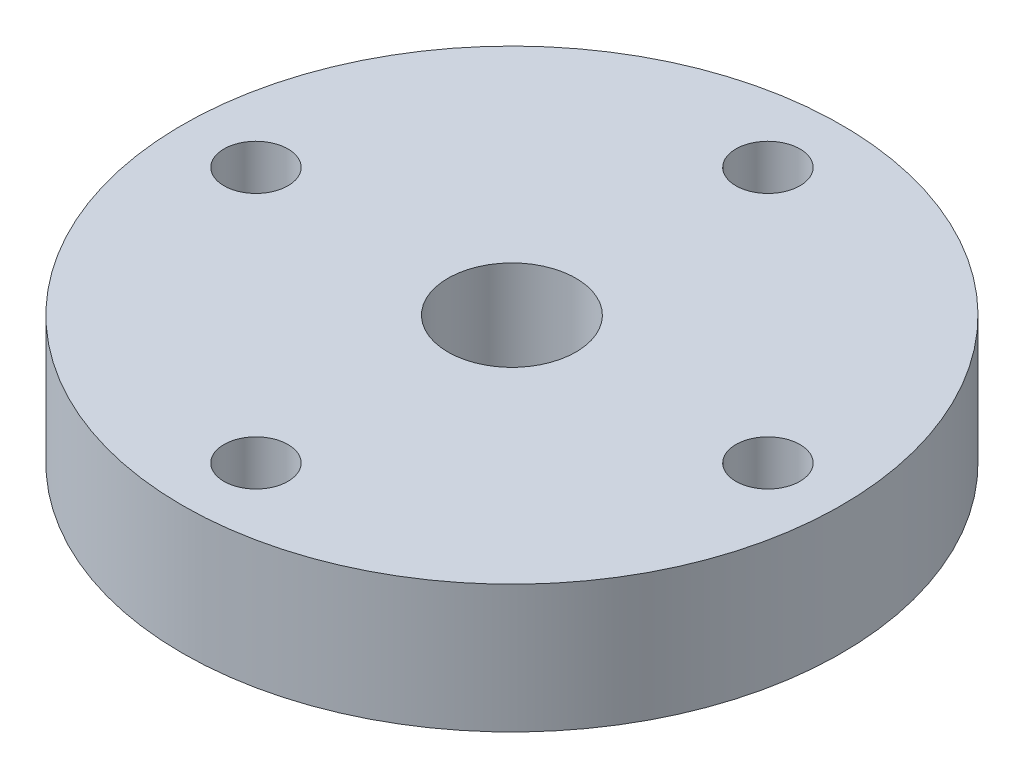
ISO-10303-21;
HEADER;
FILE_DESCRIPTION(('STEP AP214'),'2;1');
FILE_NAME('part.step','',(''),(''),'','','');
FILE_SCHEMA(('AUTOMOTIVE_DESIGN { 1 0 10303 214 1 1 1 1 }'));
ENDSEC;
DATA;
#1=APPLICATION_CONTEXT('core data for automotive mechanical design processes');
#2=APPLICATION_PROTOCOL_DEFINITION('international standard','automotive_design',2000,#1);
#3=PRODUCT_CONTEXT('',#1,'mechanical');
#4=PRODUCT('Part','Part','',(#3));
#5=PRODUCT_RELATED_PRODUCT_CATEGORY('part','',(#4));
#6=PRODUCT_DEFINITION_FORMATION('','',#4);
#7=PRODUCT_DEFINITION_CONTEXT('part definition',#1,'design');
#8=PRODUCT_DEFINITION('design','',#6,#7);
#9=PRODUCT_DEFINITION_SHAPE('','',#8);
#10=(LENGTH_UNIT() NAMED_UNIT(*) SI_UNIT(.MILLI.,.METRE.));
#11=(NAMED_UNIT(*) PLANE_ANGLE_UNIT() SI_UNIT($,.RADIAN.));
#12=(NAMED_UNIT(*) SI_UNIT($,.STERADIAN.) SOLID_ANGLE_UNIT());
#13=UNCERTAINTY_MEASURE_WITH_UNIT(LENGTH_MEASURE(1.E-05),#10,'distance_accuracy_value','');
#14=(GEOMETRIC_REPRESENTATION_CONTEXT(3) GLOBAL_UNCERTAINTY_ASSIGNED_CONTEXT((#13)) GLOBAL_UNIT_ASSIGNED_CONTEXT((#10,
#11,#12)) REPRESENTATION_CONTEXT('',''));
#15=CARTESIAN_POINT('',(0.,0.,0.));
#16=DIRECTION('',(0.,0.,1.));
#17=DIRECTION('',(1.,0.,0.));
#18=AXIS2_PLACEMENT_3D('',#15,#16,#17);
#19=CARTESIAN_POINT('',(0.,0.,0.));
#20=DIRECTION('',(0.,1.,0.));
#21=DIRECTION('',(0.,0.,1.));
#22=AXIS2_PLACEMENT_3D('',#19,#20,#21);
#23=PLANE('',#22);
#24=CARTESIAN_POINT('',(0.,0.,0.));
#25=DIRECTION('',(0.,1.,0.));
#26=DIRECTION('',(0.,0.,1.));
#27=AXIS2_PLACEMENT_3D('',#24,#25,#26);
#28=CIRCLE('',#27,2.);
#29=CARTESIAN_POINT('',(0.,0.,2.));
#30=VERTEX_POINT('',#29);
#31=EDGE_CURVE('E43',#30,#30,#28,.T.);
#32=ORIENTED_EDGE('',*,*,#31,.T.);
#33=EDGE_LOOP('',(#32));
#34=FACE_BOUND('',#33,.T.);
#35=CARTESIAN_POINT('',(0.,0.,0.));
#36=DIRECTION('',(0.,-1.,0.));
#37=DIRECTION('',(0.,0.,-1.));
#38=AXIS2_PLACEMENT_3D('',#35,#36,#37);
#39=CIRCLE('',#38,4.25);
#40=CARTESIAN_POINT('',(0.,0.,-4.25));
#41=VERTEX_POINT('',#40);
#42=EDGE_CURVE('E79',#41,#41,#39,.T.);
#43=ORIENTED_EDGE('',*,*,#42,.T.);
#44=EDGE_LOOP('',(#43));
#45=FACE_BOUND('',#44,.T.);
#46=ADVANCED_FACE('F30',(#34,#45),#23,.F.);
#47=CARTESIAN_POINT('',(0.,4.,0.));
#48=DIRECTION('',(0.,1.,0.));
#49=DIRECTION('',(0.,0.,1.));
#50=AXIS2_PLACEMENT_3D('',#47,#48,#49);
#51=PLANE('',#50);
#52=CARTESIAN_POINT('',(0.,4.,8.));
#53=DIRECTION('',(0.,1.,0.));
#54=DIRECTION('',(0.,0.,1.));
#55=AXIS2_PLACEMENT_3D('',#52,#53,#54);
#56=CIRCLE('',#55,1.);
#57=CARTESIAN_POINT('',(0.,4.,9.));
#58=VERTEX_POINT('',#57);
#59=EDGE_CURVE('E67',#58,#58,#56,.T.);
#60=ORIENTED_EDGE('',*,*,#59,.F.);
#61=EDGE_LOOP('',(#60));
#62=FACE_BOUND('',#61,.T.);
#63=CARTESIAN_POINT('',(8.,4.,0.));
#64=DIRECTION('',(0.,1.,0.));
#65=DIRECTION('',(0.,0.,1.));
#66=AXIS2_PLACEMENT_3D('',#63,#64,#65);
#67=CIRCLE('',#66,1.);
#68=CARTESIAN_POINT('',(8.,4.,1.));
#69=VERTEX_POINT('',#68);
#70=EDGE_CURVE('E61',#69,#69,#67,.T.);
#71=ORIENTED_EDGE('',*,*,#70,.F.);
#72=EDGE_LOOP('',(#71));
#73=FACE_BOUND('',#72,.T.);
#74=CARTESIAN_POINT('',(-8.,4.,0.));
#75=DIRECTION('',(0.,1.,0.));
#76=DIRECTION('',(0.,0.,1.));
#77=AXIS2_PLACEMENT_3D('',#74,#75,#76);
#78=CIRCLE('',#77,1.);
#79=CARTESIAN_POINT('',(-8.,4.,1.));
#80=VERTEX_POINT('',#79);
#81=EDGE_CURVE('E55',#80,#80,#78,.T.);
#82=ORIENTED_EDGE('',*,*,#81,.F.);
#83=EDGE_LOOP('',(#82));
#84=FACE_BOUND('',#83,.T.);
#85=CARTESIAN_POINT('',(0.,4.,-8.));
#86=DIRECTION('',(0.,1.,0.));
#87=DIRECTION('',(0.,0.,1.));
#88=AXIS2_PLACEMENT_3D('',#85,#86,#87);
#89=CIRCLE('',#88,1.);
#90=CARTESIAN_POINT('',(0.,4.,-7.));
#91=VERTEX_POINT('',#90);
#92=EDGE_CURVE('E49',#91,#91,#89,.T.);
#93=ORIENTED_EDGE('',*,*,#92,.F.);
#94=EDGE_LOOP('',(#93));
#95=FACE_BOUND('',#94,.T.);
#96=CARTESIAN_POINT('',(0.,4.,0.));
#97=DIRECTION('',(0.,1.,0.));
#98=DIRECTION('',(0.,0.,1.));
#99=AXIS2_PLACEMENT_3D('',#96,#97,#98);
#100=CIRCLE('',#99,10.3);
#101=CARTESIAN_POINT('',(0.,4.,10.3));
#102=VERTEX_POINT('',#101);
#103=EDGE_CURVE('E10',#102,#102,#100,.T.);
#104=ORIENTED_EDGE('',*,*,#103,.T.);
#105=EDGE_LOOP('',(#104));
#106=FACE_BOUND('',#105,.T.);
#107=CARTESIAN_POINT('',(0.,4.,0.));
#108=DIRECTION('',(0.,1.,0.));
#109=DIRECTION('',(0.,0.,1.));
#110=AXIS2_PLACEMENT_3D('',#107,#108,#109);
#111=CIRCLE('',#110,2.);
#112=CARTESIAN_POINT('',(0.,4.,2.));
#113=VERTEX_POINT('',#112);
#114=EDGE_CURVE('E41',#113,#113,#111,.T.);
#115=ORIENTED_EDGE('',*,*,#114,.F.);
#116=EDGE_LOOP('',(#115));
#117=FACE_BOUND('',#116,.T.);
#118=ADVANCED_FACE('F104',(#62,#73,#84,#95,#106,#117),#51,.T.);
#119=CARTESIAN_POINT('',(0.,0.,0.));
#120=DIRECTION('',(0.,-1.,0.));
#121=DIRECTION('',(0.,0.,-1.));
#122=AXIS2_PLACEMENT_3D('',#119,#120,#121);
#123=CIRCLE('',#122,6.);
#124=CARTESIAN_POINT('',(0.,0.,-6.));
#125=VERTEX_POINT('',#124);
#126=EDGE_CURVE('E73',#125,#125,#123,.T.);
#127=ORIENTED_EDGE('',*,*,#126,.F.);
#128=EDGE_LOOP('',(#127));
#129=FACE_BOUND('',#128,.T.);
#130=CARTESIAN_POINT('',(0.,0.,8.));
#131=DIRECTION('',(0.,1.,0.));
#132=DIRECTION('',(0.,0.,1.));
#133=AXIS2_PLACEMENT_3D('',#130,#131,#132);
#134=CIRCLE('',#133,1.);
#135=CARTESIAN_POINT('',(0.,0.,9.));
#136=VERTEX_POINT('',#135);
#137=EDGE_CURVE('E64',#136,#136,#134,.T.);
#138=ORIENTED_EDGE('',*,*,#137,.T.);
#139=EDGE_LOOP('',(#138));
#140=FACE_BOUND('',#139,.T.);
#141=CARTESIAN_POINT('',(8.,0.,0.));
#142=DIRECTION('',(0.,1.,0.));
#143=DIRECTION('',(0.,0.,1.));
#144=AXIS2_PLACEMENT_3D('',#141,#142,#143);
#145=CIRCLE('',#144,1.);
#146=CARTESIAN_POINT('',(8.,0.,1.));
#147=VERTEX_POINT('',#146);
#148=EDGE_CURVE('E58',#147,#147,#145,.T.);
#149=ORIENTED_EDGE('',*,*,#148,.T.);
#150=EDGE_LOOP('',(#149));
#151=FACE_BOUND('',#150,.T.);
#152=CARTESIAN_POINT('',(-8.,0.,0.));
#153=DIRECTION('',(0.,1.,0.));
#154=DIRECTION('',(0.,0.,1.));
#155=AXIS2_PLACEMENT_3D('',#152,#153,#154);
#156=CIRCLE('',#155,1.);
#157=CARTESIAN_POINT('',(-8.,0.,1.));
#158=VERTEX_POINT('',#157);
#159=EDGE_CURVE('E52',#158,#158,#156,.T.);
#160=ORIENTED_EDGE('',*,*,#159,.T.);
#161=EDGE_LOOP('',(#160));
#162=FACE_BOUND('',#161,.T.);
#163=CARTESIAN_POINT('',(0.,0.,-8.));
#164=DIRECTION('',(0.,1.,0.));
#165=DIRECTION('',(0.,0.,1.));
#166=AXIS2_PLACEMENT_3D('',#163,#164,#165);
#167=CIRCLE('',#166,1.);
#168=CARTESIAN_POINT('',(0.,0.,-7.));
#169=VERTEX_POINT('',#168);
#170=EDGE_CURVE('E46',#169,#169,#167,.T.);
#171=ORIENTED_EDGE('',*,*,#170,.T.);
#172=EDGE_LOOP('',(#171));
#173=FACE_BOUND('',#172,.T.);
#174=CARTESIAN_POINT('',(0.,0.,0.));
#175=DIRECTION('',(0.,1.,0.));
#176=DIRECTION('',(0.,0.,1.));
#177=AXIS2_PLACEMENT_3D('',#174,#175,#176);
#178=CIRCLE('',#177,10.3);
#179=CARTESIAN_POINT('',(0.,0.,10.3));
#180=VERTEX_POINT('',#179);
#181=EDGE_CURVE('E34',#180,#180,#178,.T.);
#182=ORIENTED_EDGE('',*,*,#181,.F.);
#183=EDGE_LOOP('',(#182));
#184=FACE_BOUND('',#183,.T.);
#185=ADVANCED_FACE('F101',(#129,#140,#151,#162,#173,#184),#23,.F.);
#186=CARTESIAN_POINT('',(0.,4.,0.));
#187=DIRECTION('',(0.,-1.,0.));
#188=DIRECTION('',(0.,0.,-1.));
#189=AXIS2_PLACEMENT_3D('',#186,#187,#188);
#190=CYLINDRICAL_SURFACE('',#189,10.3);
#191=ORIENTED_EDGE('',*,*,#103,.F.);
#192=EDGE_LOOP('',(#191));
#193=FACE_BOUND('',#192,.T.);
#194=ORIENTED_EDGE('',*,*,#181,.T.);
#195=EDGE_LOOP('',(#194));
#196=FACE_BOUND('',#195,.T.);
#197=ADVANCED_FACE('F32',(#193,#196),#190,.T.);
#198=CARTESIAN_POINT('',(0.,4.,0.));
#199=DIRECTION('',(0.,-1.,0.));
#200=DIRECTION('',(0.,0.,-1.));
#201=AXIS2_PLACEMENT_3D('',#198,#199,#200);
#202=CYLINDRICAL_SURFACE('',#201,2.);
#203=ORIENTED_EDGE('',*,*,#114,.T.);
#204=EDGE_LOOP('',(#203));
#205=FACE_BOUND('',#204,.T.);
#206=ORIENTED_EDGE('',*,*,#31,.F.);
#207=EDGE_LOOP('',(#206));
#208=FACE_BOUND('',#207,.T.);
#209=ADVANCED_FACE('F116',(#205,#208),#202,.F.);
#210=CARTESIAN_POINT('',(0.,0.,-8.));
#211=DIRECTION('',(0.,1.,0.));
#212=DIRECTION('',(0.,0.,1.));
#213=AXIS2_PLACEMENT_3D('',#210,#211,#212);
#214=CYLINDRICAL_SURFACE('',#213,1.);
#215=ORIENTED_EDGE('',*,*,#170,.F.);
#216=EDGE_LOOP('',(#215));
#217=FACE_BOUND('',#216,.T.);
#218=ORIENTED_EDGE('',*,*,#92,.T.);
#219=EDGE_LOOP('',(#218));
#220=FACE_BOUND('',#219,.T.);
#221=ADVANCED_FACE('F122',(#217,#220),#214,.F.);
#222=CARTESIAN_POINT('',(-8.,0.,0.));
#223=DIRECTION('',(0.,1.,0.));
#224=DIRECTION('',(0.,0.,1.));
#225=AXIS2_PLACEMENT_3D('',#222,#223,#224);
#226=CYLINDRICAL_SURFACE('',#225,1.);
#227=ORIENTED_EDGE('',*,*,#159,.F.);
#228=EDGE_LOOP('',(#227));
#229=FACE_BOUND('',#228,.T.);
#230=ORIENTED_EDGE('',*,*,#81,.T.);
#231=EDGE_LOOP('',(#230));
#232=FACE_BOUND('',#231,.T.);
#233=ADVANCED_FACE('F137',(#229,#232),#226,.F.);
#234=CARTESIAN_POINT('',(8.,0.,0.));
#235=DIRECTION('',(0.,1.,0.));
#236=DIRECTION('',(0.,0.,1.));
#237=AXIS2_PLACEMENT_3D('',#234,#235,#236);
#238=CYLINDRICAL_SURFACE('',#237,1.);
#239=ORIENTED_EDGE('',*,*,#148,.F.);
#240=EDGE_LOOP('',(#239));
#241=FACE_BOUND('',#240,.T.);
#242=ORIENTED_EDGE('',*,*,#70,.T.);
#243=EDGE_LOOP('',(#242));
#244=FACE_BOUND('',#243,.T.);
#245=ADVANCED_FACE('F141',(#241,#244),#238,.F.);
#246=CARTESIAN_POINT('',(0.,0.,8.));
#247=DIRECTION('',(0.,1.,0.));
#248=DIRECTION('',(0.,0.,1.));
#249=AXIS2_PLACEMENT_3D('',#246,#247,#248);
#250=CYLINDRICAL_SURFACE('',#249,1.);
#251=ORIENTED_EDGE('',*,*,#137,.F.);
#252=EDGE_LOOP('',(#251));
#253=FACE_BOUND('',#252,.T.);
#254=ORIENTED_EDGE('',*,*,#59,.T.);
#255=EDGE_LOOP('',(#254));
#256=FACE_BOUND('',#255,.T.);
#257=ADVANCED_FACE('F97',(#253,#256),#250,.F.);
#258=CARTESIAN_POINT('',(0.,2.,0.));
#259=DIRECTION('',(0.,-1.,0.));
#260=DIRECTION('',(0.,0.,-1.));
#261=AXIS2_PLACEMENT_3D('',#258,#259,#260);
#262=CYLINDRICAL_SURFACE('',#261,6.);
#263=CARTESIAN_POINT('',(0.,2.,0.));
#264=DIRECTION('',(0.,-1.,0.));
#265=DIRECTION('',(0.,0.,-1.));
#266=AXIS2_PLACEMENT_3D('',#263,#264,#265);
#267=CIRCLE('',#266,6.);
#268=CARTESIAN_POINT('',(0.,2.,-6.));
#269=VERTEX_POINT('',#268);
#270=EDGE_CURVE('E70',#269,#269,#267,.T.);
#271=ORIENTED_EDGE('',*,*,#270,.F.);
#272=EDGE_LOOP('',(#271));
#273=FACE_BOUND('',#272,.T.);
#274=ORIENTED_EDGE('',*,*,#126,.T.);
#275=EDGE_LOOP('',(#274));
#276=FACE_BOUND('',#275,.T.);
#277=ADVANCED_FACE('F91',(#273,#276),#262,.F.);
#278=CARTESIAN_POINT('',(0.,2.,0.));
#279=DIRECTION('',(0.,-1.,0.));
#280=DIRECTION('',(0.,0.,-1.));
#281=AXIS2_PLACEMENT_3D('',#278,#279,#280);
#282=PLANE('',#281);
#283=CARTESIAN_POINT('',(0.,2.,0.));
#284=DIRECTION('',(0.,-1.,0.));
#285=DIRECTION('',(0.,0.,-1.));
#286=AXIS2_PLACEMENT_3D('',#283,#284,#285);
#287=CIRCLE('',#286,4.25);
#288=CARTESIAN_POINT('',(0.,2.,-4.25));
#289=VERTEX_POINT('',#288);
#290=EDGE_CURVE('E76',#289,#289,#287,.T.);
#291=ORIENTED_EDGE('',*,*,#290,.F.);
#292=EDGE_LOOP('',(#291));
#293=FACE_BOUND('',#292,.T.);
#294=ORIENTED_EDGE('',*,*,#270,.T.);
#295=EDGE_LOOP('',(#294));
#296=FACE_BOUND('',#295,.T.);
#297=ADVANCED_FACE('F88',(#293,#296),#282,.T.);
#298=CARTESIAN_POINT('',(0.,2.,0.));
#299=DIRECTION('',(0.,-1.,0.));
#300=DIRECTION('',(0.,0.,-1.));
#301=AXIS2_PLACEMENT_3D('',#298,#299,#300);
#302=CYLINDRICAL_SURFACE('',#301,4.25);
#303=ORIENTED_EDGE('',*,*,#290,.T.);
#304=EDGE_LOOP('',(#303));
#305=FACE_BOUND('',#304,.T.);
#306=ORIENTED_EDGE('',*,*,#42,.F.);
#307=EDGE_LOOP('',(#306));
#308=FACE_BOUND('',#307,.T.);
#309=ADVANCED_FACE('F85',(#305,#308),#302,.T.);
#310=CLOSED_SHELL('',(#46,#118,#185,#197,#209,#221,#233,#245,#257,#277,#297,#309));
#311=MANIFOLD_SOLID_BREP('B2',#310);
#312=ADVANCED_BREP_SHAPE_REPRESENTATION('',(#18,#311),#14);
#313=SHAPE_DEFINITION_REPRESENTATION(#9,#312);
ENDSEC;
END-ISO-10303-21;
